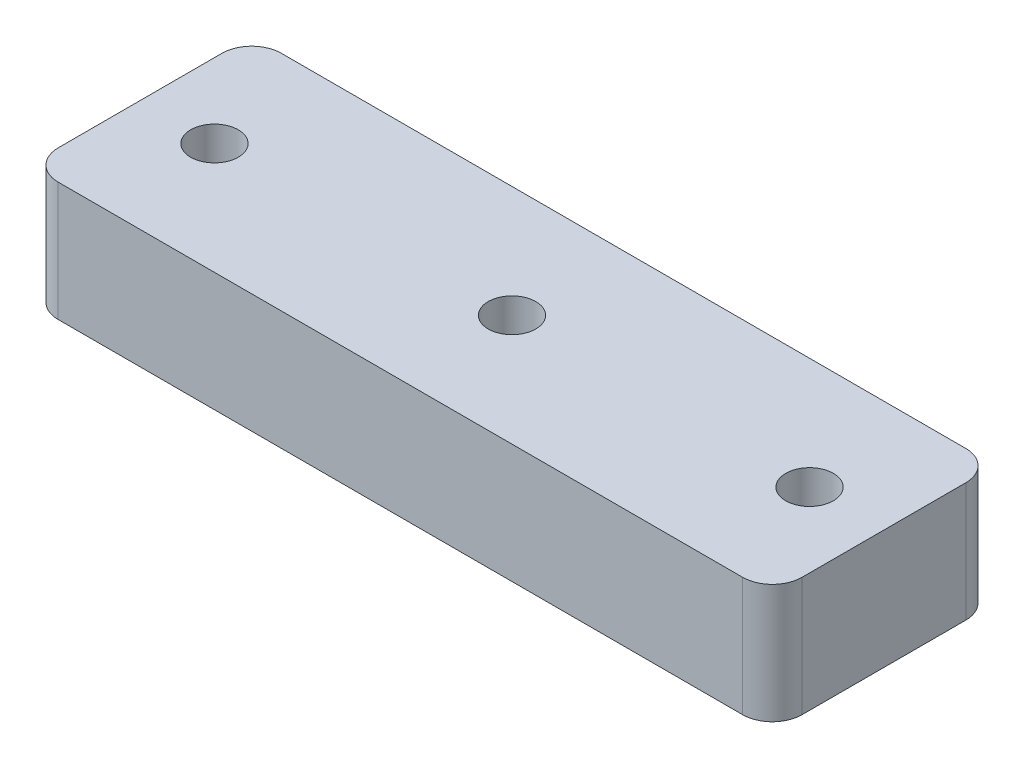
ISO-10303-21;
HEADER;
FILE_DESCRIPTION(('STEP AP214'),'2;1');
FILE_NAME('part.step','',(''),(''),'','','');
FILE_SCHEMA(('AUTOMOTIVE_DESIGN { 1 0 10303 214 1 1 1 1 }'));
ENDSEC;
DATA;
#1=APPLICATION_CONTEXT('core data for automotive mechanical design processes');
#2=APPLICATION_PROTOCOL_DEFINITION('international standard','automotive_design',2000,#1);
#3=PRODUCT_CONTEXT('',#1,'mechanical');
#4=PRODUCT('Part','Part','',(#3));
#5=PRODUCT_RELATED_PRODUCT_CATEGORY('part','',(#4));
#6=PRODUCT_DEFINITION_FORMATION('','',#4);
#7=PRODUCT_DEFINITION_CONTEXT('part definition',#1,'design');
#8=PRODUCT_DEFINITION('design','',#6,#7);
#9=PRODUCT_DEFINITION_SHAPE('','',#8);
#10=(LENGTH_UNIT() NAMED_UNIT(*) SI_UNIT(.MILLI.,.METRE.));
#11=(NAMED_UNIT(*) PLANE_ANGLE_UNIT() SI_UNIT($,.RADIAN.));
#12=(NAMED_UNIT(*) SI_UNIT($,.STERADIAN.) SOLID_ANGLE_UNIT());
#13=UNCERTAINTY_MEASURE_WITH_UNIT(LENGTH_MEASURE(1.E-05),#10,'distance_accuracy_value','');
#14=(GEOMETRIC_REPRESENTATION_CONTEXT(3) GLOBAL_UNCERTAINTY_ASSIGNED_CONTEXT((#13)) GLOBAL_UNIT_ASSIGNED_CONTEXT((#10,
#11,#12)) REPRESENTATION_CONTEXT('',''));
#15=CARTESIAN_POINT('',(0.,0.,0.));
#16=DIRECTION('',(0.,0.,1.));
#17=DIRECTION('',(1.,0.,0.));
#18=AXIS2_PLACEMENT_3D('',#15,#16,#17);
#19=CARTESIAN_POINT('',(0.,8.,0.));
#20=DIRECTION('',(0.,-1.,0.));
#21=DIRECTION('',(0.,0.,-1.));
#22=AXIS2_PLACEMENT_3D('',#19,#20,#21);
#23=PLANE('',#22);
#24=DIRECTION('',(0.,0.,1.));
#25=VECTOR('',#24,1.);
#26=CARTESIAN_POINT('',(-25.,8.,7.5));
#27=LINE('',#26,#25);
#28=CARTESIAN_POINT('',(-25.,8.,-5.5));
#29=VERTEX_POINT('',#28);
#30=CARTESIAN_POINT('',(-25.,8.,5.5));
#31=VERTEX_POINT('',#30);
#32=EDGE_CURVE('E206',#29,#31,#27,.T.);
#33=ORIENTED_EDGE('',*,*,#32,.T.);
#34=CARTESIAN_POINT('',(-23.,8.,5.5));
#35=DIRECTION('',(0.,-1.,0.));
#36=DIRECTION('',(0.,0.,-1.));
#37=AXIS2_PLACEMENT_3D('',#34,#35,#36);
#38=CIRCLE('',#37,2.);
#39=CARTESIAN_POINT('',(-23.,8.,7.5));
#40=VERTEX_POINT('',#39);
#41=EDGE_CURVE('E175',#31,#40,#38,.F.);
#42=ORIENTED_EDGE('',*,*,#41,.T.);
#43=DIRECTION('',(1.,0.,0.));
#44=VECTOR('',#43,1.);
#45=CARTESIAN_POINT('',(-25.,8.,7.5));
#46=LINE('',#45,#44);
#47=CARTESIAN_POINT('',(23.,8.,7.5));
#48=VERTEX_POINT('',#47);
#49=EDGE_CURVE('E133',#40,#48,#46,.T.);
#50=ORIENTED_EDGE('',*,*,#49,.T.);
#51=CARTESIAN_POINT('',(23.,8.,5.5));
#52=DIRECTION('',(0.,-1.,0.));
#53=DIRECTION('',(0.,0.,-1.));
#54=AXIS2_PLACEMENT_3D('',#51,#52,#53);
#55=CIRCLE('',#54,2.);
#56=CARTESIAN_POINT('',(25.,8.,5.5));
#57=VERTEX_POINT('',#56);
#58=EDGE_CURVE('E167',#48,#57,#55,.F.);
#59=ORIENTED_EDGE('',*,*,#58,.T.);
#60=DIRECTION('',(0.,0.,-1.));
#61=VECTOR('',#60,1.);
#62=CARTESIAN_POINT('',(25.,8.,7.5));
#63=LINE('',#62,#61);
#64=CARTESIAN_POINT('',(25.,8.,-5.5));
#65=VERTEX_POINT('',#64);
#66=EDGE_CURVE('E142',#57,#65,#63,.T.);
#67=ORIENTED_EDGE('',*,*,#66,.T.);
#68=CARTESIAN_POINT('',(23.,8.,-5.5));
#69=DIRECTION('',(0.,-1.,0.));
#70=DIRECTION('',(0.,0.,-1.));
#71=AXIS2_PLACEMENT_3D('',#68,#69,#70);
#72=CIRCLE('',#71,2.);
#73=CARTESIAN_POINT('',(23.,8.,-7.5));
#74=VERTEX_POINT('',#73);
#75=EDGE_CURVE('E68',#65,#74,#72,.F.);
#76=ORIENTED_EDGE('',*,*,#75,.T.);
#77=DIRECTION('',(-1.,0.,0.));
#78=VECTOR('',#77,1.);
#79=CARTESIAN_POINT('',(-25.,8.,-7.5));
#80=LINE('',#79,#78);
#81=CARTESIAN_POINT('',(-23.,8.,-7.5));
#82=VERTEX_POINT('',#81);
#83=EDGE_CURVE('E147',#74,#82,#80,.T.);
#84=ORIENTED_EDGE('',*,*,#83,.T.);
#85=CARTESIAN_POINT('',(-23.,8.,-5.5));
#86=DIRECTION('',(0.,-1.,0.));
#87=DIRECTION('',(0.,0.,-1.));
#88=AXIS2_PLACEMENT_3D('',#85,#86,#87);
#89=CIRCLE('',#88,2.);
#90=EDGE_CURVE('E172',#82,#29,#89,.F.);
#91=ORIENTED_EDGE('',*,*,#90,.T.);
#92=EDGE_LOOP('',(#33,#42,#50,#59,#67,#76,#84,#91));
#93=FACE_BOUND('',#92,.T.);
#94=CARTESIAN_POINT('',(-20.,8.,0.));
#95=DIRECTION('',(0.,1.,0.));
#96=DIRECTION('',(0.,0.,1.));
#97=AXIS2_PLACEMENT_3D('',#94,#95,#96);
#98=CIRCLE('',#97,1.6);
#99=CARTESIAN_POINT('',(-20.,8.,1.6));
#100=VERTEX_POINT('',#99);
#101=EDGE_CURVE('E196',#100,#100,#98,.T.);
#102=ORIENTED_EDGE('',*,*,#101,.F.);
#103=EDGE_LOOP('',(#102));
#104=FACE_BOUND('',#103,.T.);
#105=CARTESIAN_POINT('',(0.,8.,0.));
#106=DIRECTION('',(0.,1.,0.));
#107=DIRECTION('',(0.,0.,1.));
#108=AXIS2_PLACEMENT_3D('',#105,#106,#107);
#109=CIRCLE('',#108,1.6);
#110=CARTESIAN_POINT('',(0.,8.,1.6));
#111=VERTEX_POINT('',#110);
#112=EDGE_CURVE('E214',#111,#111,#109,.T.);
#113=ORIENTED_EDGE('',*,*,#112,.F.);
#114=EDGE_LOOP('',(#113));
#115=FACE_BOUND('',#114,.T.);
#116=CARTESIAN_POINT('',(20.,8.,0.));
#117=DIRECTION('',(0.,1.,0.));
#118=DIRECTION('',(0.,0.,1.));
#119=AXIS2_PLACEMENT_3D('',#116,#117,#118);
#120=CIRCLE('',#119,1.6);
#121=CARTESIAN_POINT('',(20.,8.,1.6));
#122=VERTEX_POINT('',#121);
#123=EDGE_CURVE('E220',#122,#122,#120,.T.);
#124=ORIENTED_EDGE('',*,*,#123,.F.);
#125=EDGE_LOOP('',(#124));
#126=FACE_BOUND('',#125,.T.);
#127=ADVANCED_FACE('F45',(#93,#104,#115,#126),#23,.F.);
#128=CARTESIAN_POINT('',(0.,0.,0.));
#129=DIRECTION('',(0.,-1.,0.));
#130=DIRECTION('',(0.,0.,-1.));
#131=AXIS2_PLACEMENT_3D('',#128,#129,#130);
#132=PLANE('',#131);
#133=CARTESIAN_POINT('',(0.,0.,0.));
#134=DIRECTION('',(0.,1.,0.));
#135=DIRECTION('',(0.,0.,1.));
#136=AXIS2_PLACEMENT_3D('',#133,#134,#135);
#137=CIRCLE('',#136,1.6);
#138=CARTESIAN_POINT('',(0.,0.,1.6));
#139=VERTEX_POINT('',#138);
#140=EDGE_CURVE('E216',#139,#139,#137,.T.);
#141=ORIENTED_EDGE('',*,*,#140,.T.);
#142=EDGE_LOOP('',(#141));
#143=FACE_BOUND('',#142,.T.);
#144=DIRECTION('',(1.,0.,0.));
#145=VECTOR('',#144,1.);
#146=CARTESIAN_POINT('',(-25.,0.,7.5));
#147=LINE('',#146,#145);
#148=CARTESIAN_POINT('',(-23.,0.,7.5));
#149=VERTEX_POINT('',#148);
#150=CARTESIAN_POINT('',(23.,0.,7.5));
#151=VERTEX_POINT('',#150);
#152=EDGE_CURVE('E130',#149,#151,#147,.T.);
#153=ORIENTED_EDGE('',*,*,#152,.F.);
#154=CARTESIAN_POINT('',(-23.,0.,5.5));
#155=DIRECTION('',(0.,-1.,0.));
#156=DIRECTION('',(0.,0.,-1.));
#157=AXIS2_PLACEMENT_3D('',#154,#155,#156);
#158=CIRCLE('',#157,2.);
#159=CARTESIAN_POINT('',(-25.,0.,5.5));
#160=VERTEX_POINT('',#159);
#161=EDGE_CURVE('E112',#149,#160,#158,.T.);
#162=ORIENTED_EDGE('',*,*,#161,.T.);
#163=DIRECTION('',(0.,0.,1.));
#164=VECTOR('',#163,1.);
#165=CARTESIAN_POINT('',(-25.,0.,7.5));
#166=LINE('',#165,#164);
#167=CARTESIAN_POINT('',(-25.,0.,-5.5));
#168=VERTEX_POINT('',#167);
#169=EDGE_CURVE('E143',#168,#160,#166,.T.);
#170=ORIENTED_EDGE('',*,*,#169,.F.);
#171=CARTESIAN_POINT('',(-23.,0.,-5.5));
#172=DIRECTION('',(0.,-1.,0.));
#173=DIRECTION('',(0.,0.,-1.));
#174=AXIS2_PLACEMENT_3D('',#171,#172,#173);
#175=CIRCLE('',#174,2.);
#176=CARTESIAN_POINT('',(-23.,0.,-7.5));
#177=VERTEX_POINT('',#176);
#178=EDGE_CURVE('E124',#168,#177,#175,.T.);
#179=ORIENTED_EDGE('',*,*,#178,.T.);
#180=DIRECTION('',(-1.,0.,0.));
#181=VECTOR('',#180,1.);
#182=CARTESIAN_POINT('',(-25.,0.,-7.5));
#183=LINE('',#182,#181);
#184=CARTESIAN_POINT('',(23.,0.,-7.5));
#185=VERTEX_POINT('',#184);
#186=EDGE_CURVE('E149',#185,#177,#183,.T.);
#187=ORIENTED_EDGE('',*,*,#186,.F.);
#188=CARTESIAN_POINT('',(23.,0.,-5.5));
#189=DIRECTION('',(0.,-1.,0.));
#190=DIRECTION('',(0.,0.,-1.));
#191=AXIS2_PLACEMENT_3D('',#188,#189,#190);
#192=CIRCLE('',#191,2.);
#193=CARTESIAN_POINT('',(25.,0.,-5.5));
#194=VERTEX_POINT('',#193);
#195=EDGE_CURVE('E157',#185,#194,#192,.T.);
#196=ORIENTED_EDGE('',*,*,#195,.T.);
#197=DIRECTION('',(0.,0.,-1.));
#198=VECTOR('',#197,1.);
#199=CARTESIAN_POINT('',(25.,0.,7.5));
#200=LINE('',#199,#198);
#201=CARTESIAN_POINT('',(25.,0.,5.5));
#202=VERTEX_POINT('',#201);
#203=EDGE_CURVE('E190',#202,#194,#200,.T.);
#204=ORIENTED_EDGE('',*,*,#203,.F.);
#205=CARTESIAN_POINT('',(23.,0.,5.5));
#206=DIRECTION('',(0.,-1.,0.));
#207=DIRECTION('',(0.,0.,-1.));
#208=AXIS2_PLACEMENT_3D('',#205,#206,#207);
#209=CIRCLE('',#208,2.);
#210=EDGE_CURVE('E135',#202,#151,#209,.T.);
#211=ORIENTED_EDGE('',*,*,#210,.T.);
#212=EDGE_LOOP('',(#153,#162,#170,#179,#187,#196,#204,#211));
#213=FACE_BOUND('',#212,.T.);
#214=CARTESIAN_POINT('',(-20.,0.,0.));
#215=DIRECTION('',(0.,1.,0.));
#216=DIRECTION('',(0.,0.,1.));
#217=AXIS2_PLACEMENT_3D('',#214,#215,#216);
#218=CIRCLE('',#217,1.6);
#219=CARTESIAN_POINT('',(-20.,0.,1.6));
#220=VERTEX_POINT('',#219);
#221=EDGE_CURVE('E201',#220,#220,#218,.T.);
#222=ORIENTED_EDGE('',*,*,#221,.T.);
#223=EDGE_LOOP('',(#222));
#224=FACE_BOUND('',#223,.T.);
#225=CARTESIAN_POINT('',(20.,0.,0.));
#226=DIRECTION('',(0.,1.,0.));
#227=DIRECTION('',(0.,0.,1.));
#228=AXIS2_PLACEMENT_3D('',#225,#226,#227);
#229=CIRCLE('',#228,1.6);
#230=CARTESIAN_POINT('',(20.,0.,1.6));
#231=VERTEX_POINT('',#230);
#232=EDGE_CURVE('E224',#231,#231,#229,.T.);
#233=ORIENTED_EDGE('',*,*,#232,.T.);
#234=EDGE_LOOP('',(#233));
#235=FACE_BOUND('',#234,.T.);
#236=ADVANCED_FACE('F138',(#143,#213,#224,#235),#132,.T.);
#237=CARTESIAN_POINT('',(25.,8.,7.5));
#238=DIRECTION('',(-1.,0.,0.));
#239=DIRECTION('',(0.,0.,1.));
#240=AXIS2_PLACEMENT_3D('',#237,#238,#239);
#241=PLANE('',#240);
#242=ORIENTED_EDGE('',*,*,#203,.T.);
#243=DIRECTION('',(0.,-1.,0.));
#244=VECTOR('',#243,1.);
#245=CARTESIAN_POINT('',(25.,8.,-5.5));
#246=LINE('',#245,#244);
#247=EDGE_CURVE('E11',#194,#65,#246,.F.);
#248=ORIENTED_EDGE('',*,*,#247,.T.);
#249=ORIENTED_EDGE('',*,*,#66,.F.);
#250=DIRECTION('',(0.,-1.,0.));
#251=VECTOR('',#250,1.);
#252=CARTESIAN_POINT('',(25.,8.,5.5));
#253=LINE('',#252,#251);
#254=EDGE_CURVE('E54',#57,#202,#253,.T.);
#255=ORIENTED_EDGE('',*,*,#254,.T.);
#256=EDGE_LOOP('',(#242,#248,#249,#255));
#257=FACE_BOUND('',#256,.T.);
#258=ADVANCED_FACE('F189',(#257),#241,.F.);
#259=CARTESIAN_POINT('',(-25.,8.,-7.5));
#260=DIRECTION('',(0.,0.,1.));
#261=DIRECTION('',(1.,0.,0.));
#262=AXIS2_PLACEMENT_3D('',#259,#260,#261);
#263=PLANE('',#262);
#264=ORIENTED_EDGE('',*,*,#186,.T.);
#265=DIRECTION('',(0.,-1.,0.));
#266=VECTOR('',#265,1.);
#267=CARTESIAN_POINT('',(-23.,8.,-7.5));
#268=LINE('',#267,#266);
#269=EDGE_CURVE('E61',#177,#82,#268,.F.);
#270=ORIENTED_EDGE('',*,*,#269,.T.);
#271=ORIENTED_EDGE('',*,*,#83,.F.);
#272=DIRECTION('',(0.,-1.,0.));
#273=VECTOR('',#272,1.);
#274=CARTESIAN_POINT('',(23.,8.,-7.5));
#275=LINE('',#274,#273);
#276=EDGE_CURVE('E178',#74,#185,#275,.T.);
#277=ORIENTED_EDGE('',*,*,#276,.T.);
#278=EDGE_LOOP('',(#264,#270,#271,#277));
#279=FACE_BOUND('',#278,.T.);
#280=ADVANCED_FACE('F253',(#279),#263,.F.);
#281=CARTESIAN_POINT('',(-25.,8.,7.5));
#282=DIRECTION('',(1.,0.,0.));
#283=DIRECTION('',(0.,0.,-1.));
#284=AXIS2_PLACEMENT_3D('',#281,#282,#283);
#285=PLANE('',#284);
#286=ORIENTED_EDGE('',*,*,#169,.T.);
#287=DIRECTION('',(0.,-1.,0.));
#288=VECTOR('',#287,1.);
#289=CARTESIAN_POINT('',(-25.,8.,5.5));
#290=LINE('',#289,#288);
#291=EDGE_CURVE('E117',#160,#31,#290,.F.);
#292=ORIENTED_EDGE('',*,*,#291,.T.);
#293=ORIENTED_EDGE('',*,*,#32,.F.);
#294=DIRECTION('',(0.,-1.,0.));
#295=VECTOR('',#294,1.);
#296=CARTESIAN_POINT('',(-25.,8.,-5.5));
#297=LINE('',#296,#295);
#298=EDGE_CURVE('E123',#29,#168,#297,.T.);
#299=ORIENTED_EDGE('',*,*,#298,.T.);
#300=EDGE_LOOP('',(#286,#292,#293,#299));
#301=FACE_BOUND('',#300,.T.);
#302=ADVANCED_FACE('F250',(#301),#285,.F.);
#303=CARTESIAN_POINT('',(-25.,8.,7.5));
#304=DIRECTION('',(0.,0.,-1.));
#305=DIRECTION('',(-1.,0.,0.));
#306=AXIS2_PLACEMENT_3D('',#303,#304,#305);
#307=PLANE('',#306);
#308=ORIENTED_EDGE('',*,*,#49,.F.);
#309=DIRECTION('',(0.,-1.,0.));
#310=VECTOR('',#309,1.);
#311=CARTESIAN_POINT('',(-23.,8.,7.5));
#312=LINE('',#311,#310);
#313=EDGE_CURVE('E116',#40,#149,#312,.T.);
#314=ORIENTED_EDGE('',*,*,#313,.T.);
#315=ORIENTED_EDGE('',*,*,#152,.T.);
#316=DIRECTION('',(0.,-1.,0.));
#317=VECTOR('',#316,1.);
#318=CARTESIAN_POINT('',(23.,8.,7.5));
#319=LINE('',#318,#317);
#320=EDGE_CURVE('E136',#151,#48,#319,.F.);
#321=ORIENTED_EDGE('',*,*,#320,.T.);
#322=EDGE_LOOP('',(#308,#314,#315,#321));
#323=FACE_BOUND('',#322,.T.);
#324=ADVANCED_FACE('F129',(#323),#307,.F.);
#325=CARTESIAN_POINT('',(-20.,8.,0.));
#326=DIRECTION('',(0.,-1.,0.));
#327=DIRECTION('',(0.,0.,-1.));
#328=AXIS2_PLACEMENT_3D('',#325,#326,#327);
#329=CYLINDRICAL_SURFACE('',#328,1.6);
#330=ORIENTED_EDGE('',*,*,#101,.T.);
#331=EDGE_LOOP('',(#330));
#332=FACE_BOUND('',#331,.T.);
#333=ORIENTED_EDGE('',*,*,#221,.F.);
#334=EDGE_LOOP('',(#333));
#335=FACE_BOUND('',#334,.T.);
#336=ADVANCED_FACE('F245',(#332,#335),#329,.F.);
#337=CARTESIAN_POINT('',(0.,8.,0.));
#338=DIRECTION('',(0.,-1.,0.));
#339=DIRECTION('',(0.,0.,-1.));
#340=AXIS2_PLACEMENT_3D('',#337,#338,#339);
#341=CYLINDRICAL_SURFACE('',#340,1.6);
#342=ORIENTED_EDGE('',*,*,#112,.T.);
#343=EDGE_LOOP('',(#342));
#344=FACE_BOUND('',#343,.T.);
#345=ORIENTED_EDGE('',*,*,#140,.F.);
#346=EDGE_LOOP('',(#345));
#347=FACE_BOUND('',#346,.T.);
#348=ADVANCED_FACE('F301',(#344,#347),#341,.F.);
#349=CARTESIAN_POINT('',(20.,8.,0.));
#350=DIRECTION('',(0.,-1.,0.));
#351=DIRECTION('',(0.,0.,-1.));
#352=AXIS2_PLACEMENT_3D('',#349,#350,#351);
#353=CYLINDRICAL_SURFACE('',#352,1.6);
#354=ORIENTED_EDGE('',*,*,#123,.T.);
#355=EDGE_LOOP('',(#354));
#356=FACE_BOUND('',#355,.T.);
#357=ORIENTED_EDGE('',*,*,#232,.F.);
#358=EDGE_LOOP('',(#357));
#359=FACE_BOUND('',#358,.T.);
#360=ADVANCED_FACE('F232',(#356,#359),#353,.F.);
#361=CARTESIAN_POINT('',(-23.,8.,5.5));
#362=DIRECTION('',(0.,-1.,0.));
#363=DIRECTION('',(0.,0.,-1.));
#364=AXIS2_PLACEMENT_3D('',#361,#362,#363);
#365=CYLINDRICAL_SURFACE('',#364,2.);
#366=ORIENTED_EDGE('',*,*,#41,.F.);
#367=ORIENTED_EDGE('',*,*,#291,.F.);
#368=ORIENTED_EDGE('',*,*,#161,.F.);
#369=ORIENTED_EDGE('',*,*,#313,.F.);
#370=EDGE_LOOP('',(#366,#367,#368,#369));
#371=FACE_BOUND('',#370,.T.);
#372=ADVANCED_FACE('F115',(#371),#365,.T.);
#373=CARTESIAN_POINT('',(-23.,8.,-5.5));
#374=DIRECTION('',(0.,-1.,0.));
#375=DIRECTION('',(0.,0.,-1.));
#376=AXIS2_PLACEMENT_3D('',#373,#374,#375);
#377=CYLINDRICAL_SURFACE('',#376,2.);
#378=ORIENTED_EDGE('',*,*,#90,.F.);
#379=ORIENTED_EDGE('',*,*,#269,.F.);
#380=ORIENTED_EDGE('',*,*,#178,.F.);
#381=ORIENTED_EDGE('',*,*,#298,.F.);
#382=EDGE_LOOP('',(#378,#379,#380,#381));
#383=FACE_BOUND('',#382,.T.);
#384=ADVANCED_FACE('F261',(#383),#377,.T.);
#385=CARTESIAN_POINT('',(23.,8.,-5.5));
#386=DIRECTION('',(0.,-1.,0.));
#387=DIRECTION('',(0.,0.,-1.));
#388=AXIS2_PLACEMENT_3D('',#385,#386,#387);
#389=CYLINDRICAL_SURFACE('',#388,2.);
#390=ORIENTED_EDGE('',*,*,#75,.F.);
#391=ORIENTED_EDGE('',*,*,#247,.F.);
#392=ORIENTED_EDGE('',*,*,#195,.F.);
#393=ORIENTED_EDGE('',*,*,#276,.F.);
#394=EDGE_LOOP('',(#390,#391,#392,#393));
#395=FACE_BOUND('',#394,.T.);
#396=ADVANCED_FACE('F263',(#395),#389,.T.);
#397=CARTESIAN_POINT('',(23.,8.,5.5));
#398=DIRECTION('',(0.,-1.,0.));
#399=DIRECTION('',(0.,0.,-1.));
#400=AXIS2_PLACEMENT_3D('',#397,#398,#399);
#401=CYLINDRICAL_SURFACE('',#400,2.);
#402=ORIENTED_EDGE('',*,*,#58,.F.);
#403=ORIENTED_EDGE('',*,*,#320,.F.);
#404=ORIENTED_EDGE('',*,*,#210,.F.);
#405=ORIENTED_EDGE('',*,*,#254,.F.);
#406=EDGE_LOOP('',(#402,#403,#404,#405));
#407=FACE_BOUND('',#406,.T.);
#408=ADVANCED_FACE('F47',(#407),#401,.T.);
#409=CLOSED_SHELL('',(#127,#236,#258,#280,#302,#324,#336,#348,#360,#372,#384,#396,#408));
#410=MANIFOLD_SOLID_BREP('B2',#409);
#411=ADVANCED_BREP_SHAPE_REPRESENTATION('',(#18,#410),#14);
#412=SHAPE_DEFINITION_REPRESENTATION(#9,#411);
ENDSEC;
END-ISO-10303-21;
